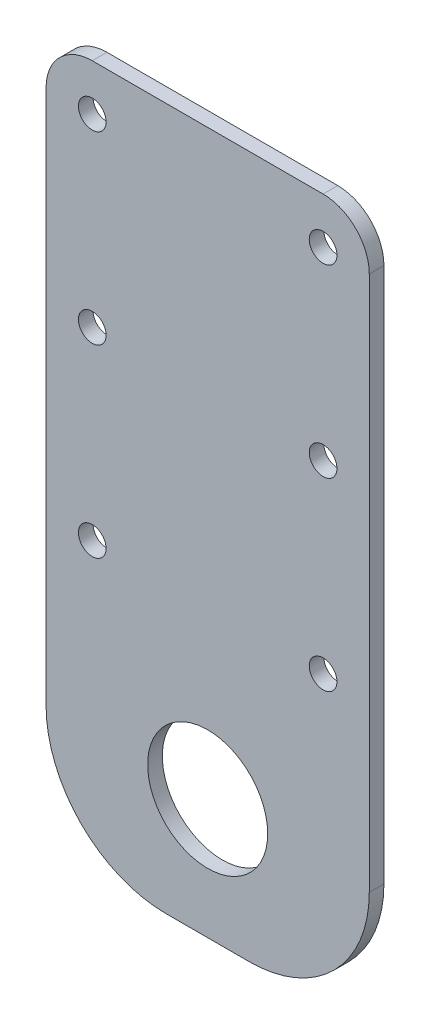
ISO-10303-21;
HEADER;
FILE_DESCRIPTION(('STEP AP214'),'2;1');
FILE_NAME('part.step','',(''),(''),'','','');
FILE_SCHEMA(('AUTOMOTIVE_DESIGN { 1 0 10303 214 1 1 1 1 }'));
ENDSEC;
DATA;
#1=APPLICATION_CONTEXT('core data for automotive mechanical design processes');
#2=APPLICATION_PROTOCOL_DEFINITION('international standard','automotive_design',2000,#1);
#3=PRODUCT_CONTEXT('',#1,'mechanical');
#4=PRODUCT('Part','Part','',(#3));
#5=PRODUCT_RELATED_PRODUCT_CATEGORY('part','',(#4));
#6=PRODUCT_DEFINITION_FORMATION('','',#4);
#7=PRODUCT_DEFINITION_CONTEXT('part definition',#1,'design');
#8=PRODUCT_DEFINITION('design','',#6,#7);
#9=PRODUCT_DEFINITION_SHAPE('','',#8);
#10=(LENGTH_UNIT() NAMED_UNIT(*) SI_UNIT(.MILLI.,.METRE.));
#11=(NAMED_UNIT(*) PLANE_ANGLE_UNIT() SI_UNIT($,.RADIAN.));
#12=(NAMED_UNIT(*) SI_UNIT($,.STERADIAN.) SOLID_ANGLE_UNIT());
#13=UNCERTAINTY_MEASURE_WITH_UNIT(LENGTH_MEASURE(1.E-05),#10,'distance_accuracy_value','');
#14=(GEOMETRIC_REPRESENTATION_CONTEXT(3) GLOBAL_UNCERTAINTY_ASSIGNED_CONTEXT((#13)) GLOBAL_UNIT_ASSIGNED_CONTEXT((#10,
#11,#12)) REPRESENTATION_CONTEXT('',''));
#15=CARTESIAN_POINT('',(0.,0.,0.));
#16=DIRECTION('',(0.,0.,1.));
#17=DIRECTION('',(1.,0.,0.));
#18=AXIS2_PLACEMENT_3D('',#15,#16,#17);
#19=CARTESIAN_POINT('',(0.,0.,1.5875));
#20=DIRECTION('',(0.,0.,1.));
#21=DIRECTION('',(1.,0.,0.));
#22=AXIS2_PLACEMENT_3D('',#19,#20,#21);
#23=PLANE('',#22);
#24=CARTESIAN_POINT('',(30.,25.,1.5875));
#25=DIRECTION('',(0.,0.,1.));
#26=DIRECTION('',(-1.,0.,0.));
#27=AXIS2_PLACEMENT_3D('',#24,#25,#26);
#28=CIRCLE('',#27,1.5);
#29=CARTESIAN_POINT('',(28.5,25.,1.5875));
#30=VERTEX_POINT('',#29);
#31=EDGE_CURVE('E203',#30,#30,#28,.T.);
#32=ORIENTED_EDGE('',*,*,#31,.F.);
#33=EDGE_LOOP('',(#32));
#34=FACE_BOUND('',#33,.T.);
#35=CARTESIAN_POINT('',(5.00000000000001,5.,1.5875));
#36=DIRECTION('',(0.,0.,1.));
#37=DIRECTION('',(1.,0.,0.));
#38=AXIS2_PLACEMENT_3D('',#35,#36,#37);
#39=CIRCLE('',#38,1.5);
#40=CARTESIAN_POINT('',(6.50000000000001,5.,1.5875));
#41=VERTEX_POINT('',#40);
#42=EDGE_CURVE('E191',#41,#41,#39,.T.);
#43=ORIENTED_EDGE('',*,*,#42,.F.);
#44=EDGE_LOOP('',(#43));
#45=FACE_BOUND('',#44,.T.);
#46=CARTESIAN_POINT('',(5.,45.,1.5875));
#47=DIRECTION('',(0.,0.,1.));
#48=DIRECTION('',(1.,0.,0.));
#49=AXIS2_PLACEMENT_3D('',#46,#47,#48);
#50=CIRCLE('',#49,1.5);
#51=CARTESIAN_POINT('',(6.5,45.,1.5875));
#52=VERTEX_POINT('',#51);
#53=EDGE_CURVE('E180',#52,#52,#50,.T.);
#54=ORIENTED_EDGE('',*,*,#53,.F.);
#55=EDGE_LOOP('',(#54));
#56=FACE_BOUND('',#55,.T.);
#57=DIRECTION('',(1.,0.,0.));
#58=VECTOR('',#57,1.);
#59=CARTESIAN_POINT('',(0.,-26.,1.5875));
#60=LINE('',#59,#58);
#61=CARTESIAN_POINT('',(13.,-26.,1.5875));
#62=VERTEX_POINT('',#61);
#63=CARTESIAN_POINT('',(22.,-26.,1.5875));
#64=VERTEX_POINT('',#63);
#65=EDGE_CURVE('E125',#62,#64,#60,.T.);
#66=ORIENTED_EDGE('',*,*,#65,.T.);
#67=CARTESIAN_POINT('',(22.,-13.,1.5875));
#68=DIRECTION('',(0.,0.,1.));
#69=DIRECTION('',(1.,0.,0.));
#70=AXIS2_PLACEMENT_3D('',#67,#68,#69);
#71=CIRCLE('',#70,13.);
#72=CARTESIAN_POINT('',(35.,-13.,1.5875));
#73=VERTEX_POINT('',#72);
#74=EDGE_CURVE('E41',#64,#73,#71,.T.);
#75=ORIENTED_EDGE('',*,*,#74,.T.);
#76=DIRECTION('',(0.,1.,0.));
#77=VECTOR('',#76,1.);
#78=CARTESIAN_POINT('',(35.,-26.,1.5875));
#79=LINE('',#78,#77);
#80=CARTESIAN_POINT('',(35.,45.,1.5875));
#81=VERTEX_POINT('',#80);
#82=EDGE_CURVE('E158',#73,#81,#79,.T.);
#83=ORIENTED_EDGE('',*,*,#82,.T.);
#84=CARTESIAN_POINT('',(30.,45.,1.5875));
#85=DIRECTION('',(0.,0.,1.));
#86=DIRECTION('',(1.,0.,0.));
#87=AXIS2_PLACEMENT_3D('',#84,#85,#86);
#88=CIRCLE('',#87,5.);
#89=CARTESIAN_POINT('',(30.,50.,1.5875));
#90=VERTEX_POINT('',#89);
#91=EDGE_CURVE('E136',#81,#90,#88,.T.);
#92=ORIENTED_EDGE('',*,*,#91,.T.);
#93=DIRECTION('',(-1.,0.,0.));
#94=VECTOR('',#93,1.);
#95=CARTESIAN_POINT('',(0.,50.,1.5875));
#96=LINE('',#95,#94);
#97=CARTESIAN_POINT('',(5.,50.,1.5875));
#98=VERTEX_POINT('',#97);
#99=EDGE_CURVE('E116',#90,#98,#96,.T.);
#100=ORIENTED_EDGE('',*,*,#99,.T.);
#101=CARTESIAN_POINT('',(5.,45.,1.5875));
#102=DIRECTION('',(0.,0.,1.));
#103=DIRECTION('',(1.,0.,0.));
#104=AXIS2_PLACEMENT_3D('',#101,#102,#103);
#105=CIRCLE('',#104,5.);
#106=CARTESIAN_POINT('',(0.,45.,1.5875));
#107=VERTEX_POINT('',#106);
#108=EDGE_CURVE('E138',#98,#107,#105,.T.);
#109=ORIENTED_EDGE('',*,*,#108,.T.);
#110=DIRECTION('',(0.,-1.,0.));
#111=VECTOR('',#110,1.);
#112=CARTESIAN_POINT('',(0.,0.,1.5875));
#113=LINE('',#112,#111);
#114=CARTESIAN_POINT('',(0.,-13.,1.5875));
#115=VERTEX_POINT('',#114);
#116=EDGE_CURVE('E115',#107,#115,#113,.T.);
#117=ORIENTED_EDGE('',*,*,#116,.T.);
#118=CARTESIAN_POINT('',(13.,-13.,1.5875));
#119=DIRECTION('',(0.,0.,1.));
#120=DIRECTION('',(1.,0.,0.));
#121=AXIS2_PLACEMENT_3D('',#118,#119,#120);
#122=CIRCLE('',#121,13.);
#123=EDGE_CURVE('E153',#115,#62,#122,.T.);
#124=ORIENTED_EDGE('',*,*,#123,.T.);
#125=EDGE_LOOP('',(#66,#75,#83,#92,#100,#109,#117,#124));
#126=FACE_BOUND('',#125,.T.);
#127=CARTESIAN_POINT('',(17.5,-13.,1.5875));
#128=DIRECTION('',(0.,0.,1.));
#129=DIRECTION('',(1.,0.,0.));
#130=AXIS2_PLACEMENT_3D('',#127,#128,#129);
#131=CIRCLE('',#130,6.50000000000001);
#132=CARTESIAN_POINT('',(24.,-13.,1.5875));
#133=VERTEX_POINT('',#132);
#134=EDGE_CURVE('E170',#133,#133,#131,.T.);
#135=ORIENTED_EDGE('',*,*,#134,.F.);
#136=EDGE_LOOP('',(#135));
#137=FACE_BOUND('',#136,.T.);
#138=CARTESIAN_POINT('',(5.,25.,1.5875));
#139=DIRECTION('',(0.,0.,1.));
#140=DIRECTION('',(1.,0.,0.));
#141=AXIS2_PLACEMENT_3D('',#138,#139,#140);
#142=CIRCLE('',#141,1.5);
#143=CARTESIAN_POINT('',(6.5,25.,1.5875));
#144=VERTEX_POINT('',#143);
#145=EDGE_CURVE('E185',#144,#144,#142,.T.);
#146=ORIENTED_EDGE('',*,*,#145,.F.);
#147=EDGE_LOOP('',(#146));
#148=FACE_BOUND('',#147,.T.);
#149=CARTESIAN_POINT('',(30.,5.00000000000001,1.5875));
#150=DIRECTION('',(0.,0.,1.));
#151=DIRECTION('',(-1.,0.,0.));
#152=AXIS2_PLACEMENT_3D('',#149,#150,#151);
#153=CIRCLE('',#152,1.5);
#154=CARTESIAN_POINT('',(28.5,5.00000000000001,1.5875));
#155=VERTEX_POINT('',#154);
#156=EDGE_CURVE('E197',#155,#155,#153,.T.);
#157=ORIENTED_EDGE('',*,*,#156,.F.);
#158=EDGE_LOOP('',(#157));
#159=FACE_BOUND('',#158,.T.);
#160=CARTESIAN_POINT('',(30.,45.,1.5875));
#161=DIRECTION('',(0.,0.,1.));
#162=DIRECTION('',(-1.,0.,0.));
#163=AXIS2_PLACEMENT_3D('',#160,#161,#162);
#164=CIRCLE('',#163,1.5);
#165=CARTESIAN_POINT('',(28.5,45.,1.5875));
#166=VERTEX_POINT('',#165);
#167=EDGE_CURVE('E209',#166,#166,#164,.T.);
#168=ORIENTED_EDGE('',*,*,#167,.F.);
#169=EDGE_LOOP('',(#168));
#170=FACE_BOUND('',#169,.T.);
#171=ADVANCED_FACE('F33',(#34,#45,#56,#126,#137,#148,#159,#170),#23,.T.);
#172=CARTESIAN_POINT('',(0.,0.,0.));
#173=DIRECTION('',(0.,0.,1.));
#174=DIRECTION('',(1.,0.,0.));
#175=AXIS2_PLACEMENT_3D('',#172,#173,#174);
#176=PLANE('',#175);
#177=DIRECTION('',(0.,1.,0.));
#178=VECTOR('',#177,1.);
#179=CARTESIAN_POINT('',(35.,50.,0.));
#180=LINE('',#179,#178);
#181=CARTESIAN_POINT('',(35.,-13.,0.));
#182=VERTEX_POINT('',#181);
#183=CARTESIAN_POINT('',(35.,45.,0.));
#184=VERTEX_POINT('',#183);
#185=EDGE_CURVE('E127',#182,#184,#180,.T.);
#186=ORIENTED_EDGE('',*,*,#185,.F.);
#187=CARTESIAN_POINT('',(22.,-13.,0.));
#188=DIRECTION('',(0.,0.,1.));
#189=DIRECTION('',(1.,0.,0.));
#190=AXIS2_PLACEMENT_3D('',#187,#188,#189);
#191=CIRCLE('',#190,13.);
#192=CARTESIAN_POINT('',(22.,-26.,0.));
#193=VERTEX_POINT('',#192);
#194=EDGE_CURVE('E147',#182,#193,#191,.F.);
#195=ORIENTED_EDGE('',*,*,#194,.T.);
#196=DIRECTION('',(1.,0.,0.));
#197=VECTOR('',#196,1.);
#198=CARTESIAN_POINT('',(0.,-26.,0.));
#199=LINE('',#198,#197);
#200=CARTESIAN_POINT('',(13.,-26.,0.));
#201=VERTEX_POINT('',#200);
#202=EDGE_CURVE('E167',#201,#193,#199,.T.);
#203=ORIENTED_EDGE('',*,*,#202,.F.);
#204=CARTESIAN_POINT('',(13.,-13.,0.));
#205=DIRECTION('',(0.,0.,1.));
#206=DIRECTION('',(1.,0.,0.));
#207=AXIS2_PLACEMENT_3D('',#204,#205,#206);
#208=CIRCLE('',#207,13.);
#209=CARTESIAN_POINT('',(0.,-13.,0.));
#210=VERTEX_POINT('',#209);
#211=EDGE_CURVE('E122',#201,#210,#208,.F.);
#212=ORIENTED_EDGE('',*,*,#211,.T.);
#213=DIRECTION('',(0.,-1.,0.));
#214=VECTOR('',#213,1.);
#215=CARTESIAN_POINT('',(0.,0.,0.));
#216=LINE('',#215,#214);
#217=CARTESIAN_POINT('',(0.,45.,0.));
#218=VERTEX_POINT('',#217);
#219=EDGE_CURVE('E114',#218,#210,#216,.T.);
#220=ORIENTED_EDGE('',*,*,#219,.F.);
#221=CARTESIAN_POINT('',(5.,45.,0.));
#222=DIRECTION('',(0.,0.,1.));
#223=DIRECTION('',(1.,0.,0.));
#224=AXIS2_PLACEMENT_3D('',#221,#222,#223);
#225=CIRCLE('',#224,5.);
#226=CARTESIAN_POINT('',(5.,50.,0.));
#227=VERTEX_POINT('',#226);
#228=EDGE_CURVE('E100',#218,#227,#225,.F.);
#229=ORIENTED_EDGE('',*,*,#228,.T.);
#230=DIRECTION('',(-1.,0.,0.));
#231=VECTOR('',#230,1.);
#232=CARTESIAN_POINT('',(0.,50.,0.));
#233=LINE('',#232,#231);
#234=CARTESIAN_POINT('',(30.,50.,0.));
#235=VERTEX_POINT('',#234);
#236=EDGE_CURVE('E123',#235,#227,#233,.T.);
#237=ORIENTED_EDGE('',*,*,#236,.F.);
#238=CARTESIAN_POINT('',(30.,45.,0.));
#239=DIRECTION('',(0.,0.,1.));
#240=DIRECTION('',(1.,0.,0.));
#241=AXIS2_PLACEMENT_3D('',#238,#239,#240);
#242=CIRCLE('',#241,5.);
#243=EDGE_CURVE('E111',#235,#184,#242,.F.);
#244=ORIENTED_EDGE('',*,*,#243,.T.);
#245=EDGE_LOOP('',(#186,#195,#203,#212,#220,#229,#237,#244));
#246=FACE_BOUND('',#245,.T.);
#247=CARTESIAN_POINT('',(17.5,-13.,0.));
#248=DIRECTION('',(0.,0.,1.));
#249=DIRECTION('',(1.,0.,0.));
#250=AXIS2_PLACEMENT_3D('',#247,#248,#249);
#251=CIRCLE('',#250,6.50000000000001);
#252=CARTESIAN_POINT('',(24.,-13.,0.));
#253=VERTEX_POINT('',#252);
#254=EDGE_CURVE('E173',#253,#253,#251,.T.);
#255=ORIENTED_EDGE('',*,*,#254,.T.);
#256=EDGE_LOOP('',(#255));
#257=FACE_BOUND('',#256,.T.);
#258=CARTESIAN_POINT('',(5.,45.,0.));
#259=DIRECTION('',(0.,0.,1.));
#260=DIRECTION('',(1.,0.,0.));
#261=AXIS2_PLACEMENT_3D('',#258,#259,#260);
#262=CIRCLE('',#261,1.5);
#263=CARTESIAN_POINT('',(6.5,45.,0.));
#264=VERTEX_POINT('',#263);
#265=EDGE_CURVE('E182',#264,#264,#262,.T.);
#266=ORIENTED_EDGE('',*,*,#265,.T.);
#267=EDGE_LOOP('',(#266));
#268=FACE_BOUND('',#267,.T.);
#269=CARTESIAN_POINT('',(5.,25.,0.));
#270=DIRECTION('',(0.,0.,1.));
#271=DIRECTION('',(1.,0.,0.));
#272=AXIS2_PLACEMENT_3D('',#269,#270,#271);
#273=CIRCLE('',#272,1.5);
#274=CARTESIAN_POINT('',(6.5,25.,0.));
#275=VERTEX_POINT('',#274);
#276=EDGE_CURVE('E188',#275,#275,#273,.T.);
#277=ORIENTED_EDGE('',*,*,#276,.T.);
#278=EDGE_LOOP('',(#277));
#279=FACE_BOUND('',#278,.T.);
#280=CARTESIAN_POINT('',(5.00000000000001,5.,0.));
#281=DIRECTION('',(0.,0.,1.));
#282=DIRECTION('',(1.,0.,0.));
#283=AXIS2_PLACEMENT_3D('',#280,#281,#282);
#284=CIRCLE('',#283,1.5);
#285=CARTESIAN_POINT('',(6.50000000000001,5.,0.));
#286=VERTEX_POINT('',#285);
#287=EDGE_CURVE('E194',#286,#286,#284,.T.);
#288=ORIENTED_EDGE('',*,*,#287,.T.);
#289=EDGE_LOOP('',(#288));
#290=FACE_BOUND('',#289,.T.);
#291=CARTESIAN_POINT('',(30.,5.00000000000001,0.));
#292=DIRECTION('',(0.,0.,1.));
#293=DIRECTION('',(-1.,0.,0.));
#294=AXIS2_PLACEMENT_3D('',#291,#292,#293);
#295=CIRCLE('',#294,1.5);
#296=CARTESIAN_POINT('',(28.5,5.00000000000001,0.));
#297=VERTEX_POINT('',#296);
#298=EDGE_CURVE('E200',#297,#297,#295,.T.);
#299=ORIENTED_EDGE('',*,*,#298,.T.);
#300=EDGE_LOOP('',(#299));
#301=FACE_BOUND('',#300,.T.);
#302=CARTESIAN_POINT('',(30.,25.,0.));
#303=DIRECTION('',(0.,0.,1.));
#304=DIRECTION('',(-1.,0.,0.));
#305=AXIS2_PLACEMENT_3D('',#302,#303,#304);
#306=CIRCLE('',#305,1.5);
#307=CARTESIAN_POINT('',(28.5,25.,0.));
#308=VERTEX_POINT('',#307);
#309=EDGE_CURVE('E206',#308,#308,#306,.T.);
#310=ORIENTED_EDGE('',*,*,#309,.T.);
#311=EDGE_LOOP('',(#310));
#312=FACE_BOUND('',#311,.T.);
#313=CARTESIAN_POINT('',(30.,45.,0.));
#314=DIRECTION('',(0.,0.,1.));
#315=DIRECTION('',(-1.,0.,0.));
#316=AXIS2_PLACEMENT_3D('',#313,#314,#315);
#317=CIRCLE('',#316,1.5);
#318=CARTESIAN_POINT('',(28.5,45.,0.));
#319=VERTEX_POINT('',#318);
#320=EDGE_CURVE('E212',#319,#319,#317,.T.);
#321=ORIENTED_EDGE('',*,*,#320,.T.);
#322=EDGE_LOOP('',(#321));
#323=FACE_BOUND('',#322,.T.);
#324=ADVANCED_FACE('F119',(#246,#257,#268,#279,#290,#301,#312,#323),#176,.F.);
#325=CARTESIAN_POINT('',(0.,-26.,1.5875));
#326=DIRECTION('',(0.,1.,0.));
#327=DIRECTION('',(-1.,0.,0.));
#328=AXIS2_PLACEMENT_3D('',#325,#326,#327);
#329=PLANE('',#328);
#330=ORIENTED_EDGE('',*,*,#202,.T.);
#331=DIRECTION('',(0.,0.,-1.));
#332=VECTOR('',#331,1.);
#333=CARTESIAN_POINT('',(22.,-26.,1.5875));
#334=LINE('',#333,#332);
#335=EDGE_CURVE('E54',#193,#64,#334,.F.);
#336=ORIENTED_EDGE('',*,*,#335,.T.);
#337=ORIENTED_EDGE('',*,*,#65,.F.);
#338=DIRECTION('',(0.,0.,-1.));
#339=VECTOR('',#338,1.);
#340=CARTESIAN_POINT('',(13.,-26.,1.5875));
#341=LINE('',#340,#339);
#342=EDGE_CURVE('E149',#62,#201,#341,.T.);
#343=ORIENTED_EDGE('',*,*,#342,.T.);
#344=EDGE_LOOP('',(#330,#336,#337,#343));
#345=FACE_BOUND('',#344,.T.);
#346=ADVANCED_FACE('F168',(#345),#329,.F.);
#347=CARTESIAN_POINT('',(35.,50.,1.5875));
#348=DIRECTION('',(-1.,0.,0.));
#349=DIRECTION('',(0.,-1.,0.));
#350=AXIS2_PLACEMENT_3D('',#347,#348,#349);
#351=PLANE('',#350);
#352=ORIENTED_EDGE('',*,*,#82,.F.);
#353=DIRECTION('',(0.,0.,-1.));
#354=VECTOR('',#353,1.);
#355=CARTESIAN_POINT('',(35.,-13.,1.5875));
#356=LINE('',#355,#354);
#357=EDGE_CURVE('E143',#73,#182,#356,.T.);
#358=ORIENTED_EDGE('',*,*,#357,.T.);
#359=ORIENTED_EDGE('',*,*,#185,.T.);
#360=DIRECTION('',(0.,0.,-1.));
#361=VECTOR('',#360,1.);
#362=CARTESIAN_POINT('',(35.,45.,1.5875));
#363=LINE('',#362,#361);
#364=EDGE_CURVE('E140',#184,#81,#363,.F.);
#365=ORIENTED_EDGE('',*,*,#364,.T.);
#366=EDGE_LOOP('',(#352,#358,#359,#365));
#367=FACE_BOUND('',#366,.T.);
#368=ADVANCED_FACE('F162',(#367),#351,.F.);
#369=CARTESIAN_POINT('',(0.,50.,1.5875));
#370=DIRECTION('',(0.,-1.,0.));
#371=DIRECTION('',(1.,0.,0.));
#372=AXIS2_PLACEMENT_3D('',#369,#370,#371);
#373=PLANE('',#372);
#374=ORIENTED_EDGE('',*,*,#236,.T.);
#375=DIRECTION('',(0.,0.,-1.));
#376=VECTOR('',#375,1.);
#377=CARTESIAN_POINT('',(5.,50.,1.5875));
#378=LINE('',#377,#376);
#379=EDGE_CURVE('E105',#227,#98,#378,.F.);
#380=ORIENTED_EDGE('',*,*,#379,.T.);
#381=ORIENTED_EDGE('',*,*,#99,.F.);
#382=DIRECTION('',(0.,0.,-1.));
#383=VECTOR('',#382,1.);
#384=CARTESIAN_POINT('',(30.,50.,1.5875));
#385=LINE('',#384,#383);
#386=EDGE_CURVE('E110',#90,#235,#385,.T.);
#387=ORIENTED_EDGE('',*,*,#386,.T.);
#388=EDGE_LOOP('',(#374,#380,#381,#387));
#389=FACE_BOUND('',#388,.T.);
#390=ADVANCED_FACE('F236',(#389),#373,.F.);
#391=CARTESIAN_POINT('',(0.,0.,1.5875));
#392=DIRECTION('',(1.,0.,0.));
#393=DIRECTION('',(0.,0.,-1.));
#394=AXIS2_PLACEMENT_3D('',#391,#392,#393);
#395=PLANE('',#394);
#396=ORIENTED_EDGE('',*,*,#219,.T.);
#397=DIRECTION('',(0.,0.,-1.));
#398=VECTOR('',#397,1.);
#399=CARTESIAN_POINT('',(0.,-13.,1.5875));
#400=LINE('',#399,#398);
#401=EDGE_CURVE('E11',#210,#115,#400,.F.);
#402=ORIENTED_EDGE('',*,*,#401,.T.);
#403=ORIENTED_EDGE('',*,*,#116,.F.);
#404=DIRECTION('',(0.,0.,-1.));
#405=VECTOR('',#404,1.);
#406=CARTESIAN_POINT('',(0.,45.,1.5875));
#407=LINE('',#406,#405);
#408=EDGE_CURVE('E104',#107,#218,#407,.T.);
#409=ORIENTED_EDGE('',*,*,#408,.T.);
#410=EDGE_LOOP('',(#396,#402,#403,#409));
#411=FACE_BOUND('',#410,.T.);
#412=ADVANCED_FACE('F113',(#411),#395,.F.);
#413=CARTESIAN_POINT('',(17.5,-13.,1.5875));
#414=DIRECTION('',(0.,0.,-1.));
#415=DIRECTION('',(-1.,0.,0.));
#416=AXIS2_PLACEMENT_3D('',#413,#414,#415);
#417=CYLINDRICAL_SURFACE('',#416,6.50000000000001);
#418=ORIENTED_EDGE('',*,*,#134,.T.);
#419=EDGE_LOOP('',(#418));
#420=FACE_BOUND('',#419,.T.);
#421=ORIENTED_EDGE('',*,*,#254,.F.);
#422=EDGE_LOOP('',(#421));
#423=FACE_BOUND('',#422,.T.);
#424=ADVANCED_FACE('F231',(#420,#423),#417,.F.);
#425=CARTESIAN_POINT('',(5.,45.,1.5875));
#426=DIRECTION('',(0.,0.,-1.));
#427=DIRECTION('',(-1.,0.,0.));
#428=AXIS2_PLACEMENT_3D('',#425,#426,#427);
#429=CYLINDRICAL_SURFACE('',#428,1.5);
#430=ORIENTED_EDGE('',*,*,#53,.T.);
#431=EDGE_LOOP('',(#430));
#432=FACE_BOUND('',#431,.T.);
#433=ORIENTED_EDGE('',*,*,#265,.F.);
#434=EDGE_LOOP('',(#433));
#435=FACE_BOUND('',#434,.T.);
#436=ADVANCED_FACE('F361',(#432,#435),#429,.F.);
#437=CARTESIAN_POINT('',(5.,25.,1.5875));
#438=DIRECTION('',(0.,0.,-1.));
#439=DIRECTION('',(-1.,0.,0.));
#440=AXIS2_PLACEMENT_3D('',#437,#438,#439);
#441=CYLINDRICAL_SURFACE('',#440,1.5);
#442=ORIENTED_EDGE('',*,*,#145,.T.);
#443=EDGE_LOOP('',(#442));
#444=FACE_BOUND('',#443,.T.);
#445=ORIENTED_EDGE('',*,*,#276,.F.);
#446=EDGE_LOOP('',(#445));
#447=FACE_BOUND('',#446,.T.);
#448=ADVANCED_FACE('F351',(#444,#447),#441,.F.);
#449=CARTESIAN_POINT('',(5.00000000000001,5.,1.5875));
#450=DIRECTION('',(0.,0.,-1.));
#451=DIRECTION('',(-1.,0.,0.));
#452=AXIS2_PLACEMENT_3D('',#449,#450,#451);
#453=CYLINDRICAL_SURFACE('',#452,1.5);
#454=ORIENTED_EDGE('',*,*,#42,.T.);
#455=EDGE_LOOP('',(#454));
#456=FACE_BOUND('',#455,.T.);
#457=ORIENTED_EDGE('',*,*,#287,.F.);
#458=EDGE_LOOP('',(#457));
#459=FACE_BOUND('',#458,.T.);
#460=ADVANCED_FACE('F341',(#456,#459),#453,.F.);
#461=CARTESIAN_POINT('',(30.,5.00000000000001,1.5875));
#462=DIRECTION('',(0.,0.,-1.));
#463=DIRECTION('',(-1.,0.,0.));
#464=AXIS2_PLACEMENT_3D('',#461,#462,#463);
#465=CYLINDRICAL_SURFACE('',#464,1.5);
#466=ORIENTED_EDGE('',*,*,#156,.T.);
#467=EDGE_LOOP('',(#466));
#468=FACE_BOUND('',#467,.T.);
#469=ORIENTED_EDGE('',*,*,#298,.F.);
#470=EDGE_LOOP('',(#469));
#471=FACE_BOUND('',#470,.T.);
#472=ADVANCED_FACE('F331',(#468,#471),#465,.F.);
#473=CARTESIAN_POINT('',(30.,25.,1.5875));
#474=DIRECTION('',(0.,0.,-1.));
#475=DIRECTION('',(-1.,0.,0.));
#476=AXIS2_PLACEMENT_3D('',#473,#474,#475);
#477=CYLINDRICAL_SURFACE('',#476,1.5);
#478=ORIENTED_EDGE('',*,*,#31,.T.);
#479=EDGE_LOOP('',(#478));
#480=FACE_BOUND('',#479,.T.);
#481=ORIENTED_EDGE('',*,*,#309,.F.);
#482=EDGE_LOOP('',(#481));
#483=FACE_BOUND('',#482,.T.);
#484=ADVANCED_FACE('F322',(#480,#483),#477,.F.);
#485=CARTESIAN_POINT('',(30.,45.,1.5875));
#486=DIRECTION('',(0.,0.,-1.));
#487=DIRECTION('',(-1.,0.,0.));
#488=AXIS2_PLACEMENT_3D('',#485,#486,#487);
#489=CYLINDRICAL_SURFACE('',#488,1.5);
#490=ORIENTED_EDGE('',*,*,#167,.T.);
#491=EDGE_LOOP('',(#490));
#492=FACE_BOUND('',#491,.T.);
#493=ORIENTED_EDGE('',*,*,#320,.F.);
#494=EDGE_LOOP('',(#493));
#495=FACE_BOUND('',#494,.T.);
#496=ADVANCED_FACE('F218',(#492,#495),#489,.F.);
#497=CARTESIAN_POINT('',(5.,45.,1.5875));
#498=DIRECTION('',(0.,0.,-1.));
#499=DIRECTION('',(-1.,0.,0.));
#500=AXIS2_PLACEMENT_3D('',#497,#498,#499);
#501=CYLINDRICAL_SURFACE('',#500,5.);
#502=ORIENTED_EDGE('',*,*,#108,.F.);
#503=ORIENTED_EDGE('',*,*,#379,.F.);
#504=ORIENTED_EDGE('',*,*,#228,.F.);
#505=ORIENTED_EDGE('',*,*,#408,.F.);
#506=EDGE_LOOP('',(#502,#503,#504,#505));
#507=FACE_BOUND('',#506,.T.);
#508=ADVANCED_FACE('F103',(#507),#501,.T.);
#509=CARTESIAN_POINT('',(30.,45.,1.5875));
#510=DIRECTION('',(0.,0.,-1.));
#511=DIRECTION('',(-1.,0.,0.));
#512=AXIS2_PLACEMENT_3D('',#509,#510,#511);
#513=CYLINDRICAL_SURFACE('',#512,5.);
#514=ORIENTED_EDGE('',*,*,#91,.F.);
#515=ORIENTED_EDGE('',*,*,#364,.F.);
#516=ORIENTED_EDGE('',*,*,#243,.F.);
#517=ORIENTED_EDGE('',*,*,#386,.F.);
#518=EDGE_LOOP('',(#514,#515,#516,#517));
#519=FACE_BOUND('',#518,.T.);
#520=ADVANCED_FACE('F246',(#519),#513,.T.);
#521=CARTESIAN_POINT('',(22.,-13.,1.5875));
#522=DIRECTION('',(0.,0.,-1.));
#523=DIRECTION('',(-1.,0.,0.));
#524=AXIS2_PLACEMENT_3D('',#521,#522,#523);
#525=CYLINDRICAL_SURFACE('',#524,13.);
#526=ORIENTED_EDGE('',*,*,#74,.F.);
#527=ORIENTED_EDGE('',*,*,#335,.F.);
#528=ORIENTED_EDGE('',*,*,#194,.F.);
#529=ORIENTED_EDGE('',*,*,#357,.F.);
#530=EDGE_LOOP('',(#526,#527,#528,#529));
#531=FACE_BOUND('',#530,.T.);
#532=ADVANCED_FACE('F166',(#531),#525,.T.);
#533=CARTESIAN_POINT('',(13.,-13.,1.5875));
#534=DIRECTION('',(0.,0.,-1.));
#535=DIRECTION('',(-1.,0.,0.));
#536=AXIS2_PLACEMENT_3D('',#533,#534,#535);
#537=CYLINDRICAL_SURFACE('',#536,13.);
#538=ORIENTED_EDGE('',*,*,#123,.F.);
#539=ORIENTED_EDGE('',*,*,#401,.F.);
#540=ORIENTED_EDGE('',*,*,#211,.F.);
#541=ORIENTED_EDGE('',*,*,#342,.F.);
#542=EDGE_LOOP('',(#538,#539,#540,#541));
#543=FACE_BOUND('',#542,.T.);
#544=ADVANCED_FACE('F35',(#543),#537,.T.);
#545=CLOSED_SHELL('',(#171,#324,#346,#368,#390,#412,#424,#436,#448,#460,#472,#484,#496,#508,
#520,#532,#544));
#546=MANIFOLD_SOLID_BREP('B2',#545);
#547=ADVANCED_BREP_SHAPE_REPRESENTATION('',(#18,#546),#14);
#548=SHAPE_DEFINITION_REPRESENTATION(#9,#547);
ENDSEC;
END-ISO-10303-21;
